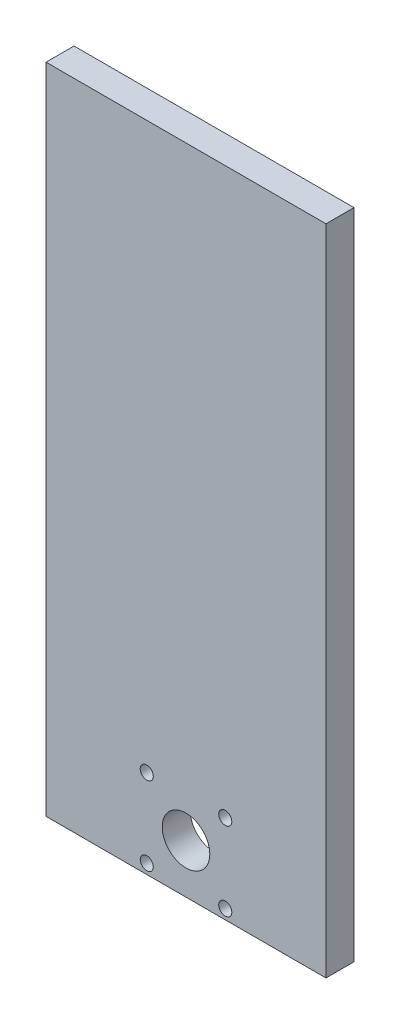
ISO-10303-21;
HEADER;
FILE_DESCRIPTION(('STEP AP214'),'2;1');
FILE_NAME('part.step','',(''),(''),'','','');
FILE_SCHEMA(('AUTOMOTIVE_DESIGN { 1 0 10303 214 1 1 1 1 }'));
ENDSEC;
DATA;
#1=APPLICATION_CONTEXT('core data for automotive mechanical design processes');
#2=APPLICATION_PROTOCOL_DEFINITION('international standard','automotive_design',2000,#1);
#3=PRODUCT_CONTEXT('',#1,'mechanical');
#4=PRODUCT('Part','Part','',(#3));
#5=PRODUCT_RELATED_PRODUCT_CATEGORY('part','',(#4));
#6=PRODUCT_DEFINITION_FORMATION('','',#4);
#7=PRODUCT_DEFINITION_CONTEXT('part definition',#1,'design');
#8=PRODUCT_DEFINITION('design','',#6,#7);
#9=PRODUCT_DEFINITION_SHAPE('','',#8);
#10=(LENGTH_UNIT() NAMED_UNIT(*) SI_UNIT(.MILLI.,.METRE.));
#11=(NAMED_UNIT(*) PLANE_ANGLE_UNIT() SI_UNIT($,.RADIAN.));
#12=(NAMED_UNIT(*) SI_UNIT($,.STERADIAN.) SOLID_ANGLE_UNIT());
#13=UNCERTAINTY_MEASURE_WITH_UNIT(LENGTH_MEASURE(1.E-05),#10,'distance_accuracy_value','');
#14=(GEOMETRIC_REPRESENTATION_CONTEXT(3) GLOBAL_UNCERTAINTY_ASSIGNED_CONTEXT((#13)) GLOBAL_UNIT_ASSIGNED_CONTEXT((#10,
#11,#12)) REPRESENTATION_CONTEXT('',''));
#15=CARTESIAN_POINT('',(0.,0.,0.));
#16=DIRECTION('',(0.,0.,1.));
#17=DIRECTION('',(1.,0.,0.));
#18=AXIS2_PLACEMENT_3D('',#15,#16,#17);
#19=CARTESIAN_POINT('',(-14.9999999999295,-291545.,77.6577310586825));
#20=DIRECTION('',(1.,0.,0.));
#21=DIRECTION('',(0.,1.,0.));
#22=AXIS2_PLACEMENT_3D('',#19,#20,#21);
#23=PLANE('',#22);
#24=DIRECTION('',(0.,-1.,0.));
#25=VECTOR('',#24,1.);
#26=CARTESIAN_POINT('',(-14.9999999999295,-291545.,1.5));
#27=LINE('',#26,#25);
#28=CARTESIAN_POINT('',(-14.9999999999864,35.000000000025,1.5));
#29=VERTEX_POINT('',#28);
#30=CARTESIAN_POINT('',(-14.9999999999864,-35.000000000025,1.5));
#31=VERTEX_POINT('',#30);
#32=EDGE_CURVE('E83',#29,#31,#27,.T.);
#33=ORIENTED_EDGE('',*,*,#32,.F.);
#34=DIRECTION('',(0.,0.,-1.));
#35=VECTOR('',#34,1.);
#36=CARTESIAN_POINT('',(-14.9999999999864,35.000000000025,77.6577310586825));
#37=LINE('',#36,#35);
#38=CARTESIAN_POINT('',(-14.9999999999864,35.000000000025,-1.5));
#39=VERTEX_POINT('',#38);
#40=EDGE_CURVE('E37',#29,#39,#37,.T.);
#41=ORIENTED_EDGE('',*,*,#40,.T.);
#42=DIRECTION('',(0.,-1.,0.));
#43=VECTOR('',#42,1.);
#44=CARTESIAN_POINT('',(-14.9999999999295,-291545.,-1.5));
#45=LINE('',#44,#43);
#46=CARTESIAN_POINT('',(-14.9999999999864,-35.000000000025,-1.5));
#47=VERTEX_POINT('',#46);
#48=EDGE_CURVE('E81',#39,#47,#45,.T.);
#49=ORIENTED_EDGE('',*,*,#48,.T.);
#50=DIRECTION('',(0.,0.,-1.));
#51=VECTOR('',#50,1.);
#52=CARTESIAN_POINT('',(-14.9999999999864,-35.000000000025,77.6577310586825));
#53=LINE('',#52,#51);
#54=EDGE_CURVE('E72',#31,#47,#53,.T.);
#55=ORIENTED_EDGE('',*,*,#54,.F.);
#56=EDGE_LOOP('',(#33,#41,#49,#55));
#57=FACE_BOUND('',#56,.T.);
#58=ADVANCED_FACE('F33',(#57),#23,.F.);
#59=CARTESIAN_POINT('',(-400000.,-35.000000000025,77.6577310586825));
#60=DIRECTION('',(0.,1.,0.));
#61=DIRECTION('',(0.,0.,1.));
#62=AXIS2_PLACEMENT_3D('',#59,#60,#61);
#63=PLANE('',#62);
#64=DIRECTION('',(1.,0.,0.));
#65=VECTOR('',#64,1.);
#66=CARTESIAN_POINT('',(-400000.,-35.000000000025,1.5));
#67=LINE('',#66,#65);
#68=CARTESIAN_POINT('',(15.0000000000071,-35.000000000025,1.5));
#69=VERTEX_POINT('',#68);
#70=EDGE_CURVE('E42',#31,#69,#67,.T.);
#71=ORIENTED_EDGE('',*,*,#70,.F.);
#72=ORIENTED_EDGE('',*,*,#54,.T.);
#73=DIRECTION('',(1.,0.,0.));
#74=VECTOR('',#73,1.);
#75=CARTESIAN_POINT('',(-400000.,-35.000000000025,-1.5));
#76=LINE('',#75,#74);
#77=CARTESIAN_POINT('',(15.0000000000071,-35.000000000025,-1.5));
#78=VERTEX_POINT('',#77);
#79=EDGE_CURVE('E94',#47,#78,#76,.T.);
#80=ORIENTED_EDGE('',*,*,#79,.T.);
#81=DIRECTION('',(0.,0.,-1.));
#82=VECTOR('',#81,1.);
#83=CARTESIAN_POINT('',(15.0000000000071,-35.000000000025,77.6577310586825));
#84=LINE('',#83,#82);
#85=EDGE_CURVE('E103',#69,#78,#84,.T.);
#86=ORIENTED_EDGE('',*,*,#85,.F.);
#87=EDGE_LOOP('',(#71,#72,#80,#86));
#88=FACE_BOUND('',#87,.T.);
#89=ADVANCED_FACE('F148',(#88),#63,.F.);
#90=CARTESIAN_POINT('',(15.0000000000432,-291545.,77.6577310586825));
#91=DIRECTION('',(-1.,0.,0.));
#92=DIRECTION('',(0.,-1.,0.));
#93=AXIS2_PLACEMENT_3D('',#90,#91,#92);
#94=PLANE('',#93);
#95=DIRECTION('',(0.,1.,0.));
#96=VECTOR('',#95,1.);
#97=CARTESIAN_POINT('',(15.0000000000432,-291545.,1.5));
#98=LINE('',#97,#96);
#99=CARTESIAN_POINT('',(14.9999999999864,35.000000000025,1.5));
#100=VERTEX_POINT('',#99);
#101=EDGE_CURVE('E11',#69,#100,#98,.T.);
#102=ORIENTED_EDGE('',*,*,#101,.F.);
#103=ORIENTED_EDGE('',*,*,#85,.T.);
#104=DIRECTION('',(0.,1.,0.));
#105=VECTOR('',#104,1.);
#106=CARTESIAN_POINT('',(15.0000000000432,-291545.,-1.5));
#107=LINE('',#106,#105);
#108=CARTESIAN_POINT('',(14.9999999999864,35.000000000025,-1.5));
#109=VERTEX_POINT('',#108);
#110=EDGE_CURVE('E104',#78,#109,#107,.T.);
#111=ORIENTED_EDGE('',*,*,#110,.T.);
#112=DIRECTION('',(0.,0.,-1.));
#113=VECTOR('',#112,1.);
#114=CARTESIAN_POINT('',(14.9999999999864,35.000000000025,77.6577310586825));
#115=LINE('',#114,#113);
#116=EDGE_CURVE('E55',#100,#109,#115,.T.);
#117=ORIENTED_EDGE('',*,*,#116,.F.);
#118=EDGE_LOOP('',(#102,#103,#111,#117));
#119=FACE_BOUND('',#118,.T.);
#120=ADVANCED_FACE('F147',(#119),#94,.F.);
#121=CARTESIAN_POINT('',(-400000.,35.000000000025,77.6577310586825));
#122=DIRECTION('',(0.,-1.,0.));
#123=DIRECTION('',(0.,0.,-1.));
#124=AXIS2_PLACEMENT_3D('',#121,#122,#123);
#125=PLANE('',#124);
#126=DIRECTION('',(-1.,0.,0.));
#127=VECTOR('',#126,1.);
#128=CARTESIAN_POINT('',(-400000.,35.000000000025,1.5));
#129=LINE('',#128,#127);
#130=EDGE_CURVE('E91',#100,#29,#129,.T.);
#131=ORIENTED_EDGE('',*,*,#130,.F.);
#132=ORIENTED_EDGE('',*,*,#116,.T.);
#133=DIRECTION('',(-1.,0.,0.));
#134=VECTOR('',#133,1.);
#135=CARTESIAN_POINT('',(-400000.,35.000000000025,-1.5));
#136=LINE('',#135,#134);
#137=EDGE_CURVE('E87',#109,#39,#136,.T.);
#138=ORIENTED_EDGE('',*,*,#137,.T.);
#139=ORIENTED_EDGE('',*,*,#40,.F.);
#140=EDGE_LOOP('',(#131,#132,#138,#139));
#141=FACE_BOUND('',#140,.T.);
#142=ADVANCED_FACE('F88',(#141),#125,.F.);
#143=CARTESIAN_POINT('',(0.,0.,-1.5));
#144=DIRECTION('',(0.,0.,1.));
#145=DIRECTION('',(1.,0.,0.));
#146=AXIS2_PLACEMENT_3D('',#143,#144,#145);
#147=PLANE('',#146);
#148=CARTESIAN_POINT('',(4.20728534805995,-33.95,-1.5));
#149=DIRECTION('',(0.,0.,1.));
#150=DIRECTION('',(1.,0.,0.));
#151=AXIS2_PLACEMENT_3D('',#148,#149,#150);
#152=CIRCLE('',#151,0.699999999999998);
#153=CARTESIAN_POINT('',(4.90728534805995,-33.95,-1.5));
#154=VERTEX_POINT('',#153);
#155=EDGE_CURVE('E119',#154,#154,#152,.T.);
#156=ORIENTED_EDGE('',*,*,#155,.T.);
#157=EDGE_LOOP('',(#156));
#158=FACE_BOUND('',#157,.T.);
#159=CARTESIAN_POINT('',(-4.20728534805997,-33.95,-1.5));
#160=DIRECTION('',(0.,0.,1.));
#161=DIRECTION('',(1.,0.,0.));
#162=AXIS2_PLACEMENT_3D('',#159,#160,#161);
#163=CIRCLE('',#162,0.699999999999999);
#164=CARTESIAN_POINT('',(-3.50728534805997,-33.95,-1.5));
#165=VERTEX_POINT('',#164);
#166=EDGE_CURVE('E126',#165,#165,#163,.T.);
#167=ORIENTED_EDGE('',*,*,#166,.T.);
#168=EDGE_LOOP('',(#167));
#169=FACE_BOUND('',#168,.T.);
#170=CARTESIAN_POINT('',(-4.20728534805995,-25.53542930388,-1.5));
#171=DIRECTION('',(0.,0.,1.));
#172=DIRECTION('',(1.,0.,0.));
#173=AXIS2_PLACEMENT_3D('',#170,#171,#172);
#174=CIRCLE('',#173,0.699999999999999);
#175=CARTESIAN_POINT('',(-3.50728534805995,-25.53542930388,-1.5));
#176=VERTEX_POINT('',#175);
#177=EDGE_CURVE('E118',#176,#176,#174,.T.);
#178=ORIENTED_EDGE('',*,*,#177,.T.);
#179=EDGE_LOOP('',(#178));
#180=FACE_BOUND('',#179,.T.);
#181=CARTESIAN_POINT('',(4.20728534805996,-25.5354293038801,-1.5));
#182=DIRECTION('',(0.,0.,1.));
#183=DIRECTION('',(1.,0.,0.));
#184=AXIS2_PLACEMENT_3D('',#181,#182,#183);
#185=CIRCLE('',#184,0.699999999999999);
#186=CARTESIAN_POINT('',(4.90728534805996,-25.5354293038801,-1.5));
#187=VERTEX_POINT('',#186);
#188=EDGE_CURVE('E112',#187,#187,#185,.T.);
#189=ORIENTED_EDGE('',*,*,#188,.T.);
#190=EDGE_LOOP('',(#189));
#191=FACE_BOUND('',#190,.T.);
#192=CARTESIAN_POINT('',(0.,-29.74271465194,-1.5));
#193=DIRECTION('',(0.,0.,1.));
#194=DIRECTION('',(1.,0.,0.));
#195=AXIS2_PLACEMENT_3D('',#192,#193,#194);
#196=CIRCLE('',#195,2.55);
#197=CARTESIAN_POINT('',(2.55,-29.74271465194,-1.5));
#198=VERTEX_POINT('',#197);
#199=EDGE_CURVE('E85',#198,#198,#196,.T.);
#200=ORIENTED_EDGE('',*,*,#199,.T.);
#201=EDGE_LOOP('',(#200));
#202=FACE_BOUND('',#201,.T.);
#203=ORIENTED_EDGE('',*,*,#48,.F.);
#204=ORIENTED_EDGE('',*,*,#137,.F.);
#205=ORIENTED_EDGE('',*,*,#110,.F.);
#206=ORIENTED_EDGE('',*,*,#79,.F.);
#207=EDGE_LOOP('',(#203,#204,#205,#206));
#208=FACE_BOUND('',#207,.T.);
#209=ADVANCED_FACE('F93',(#158,#169,#180,#191,#202,#208),#147,.F.);
#210=CARTESIAN_POINT('',(0.,0.,1.5));
#211=DIRECTION('',(0.,0.,1.));
#212=DIRECTION('',(1.,0.,0.));
#213=AXIS2_PLACEMENT_3D('',#210,#211,#212);
#214=PLANE('',#213);
#215=CARTESIAN_POINT('',(4.20728534805995,-33.95,1.5));
#216=DIRECTION('',(0.,0.,1.));
#217=DIRECTION('',(1.,0.,0.));
#218=AXIS2_PLACEMENT_3D('',#215,#216,#217);
#219=CIRCLE('',#218,0.699999999999998);
#220=CARTESIAN_POINT('',(4.90728534805995,-33.95,1.5));
#221=VERTEX_POINT('',#220);
#222=EDGE_CURVE('E123',#221,#221,#219,.T.);
#223=ORIENTED_EDGE('',*,*,#222,.F.);
#224=EDGE_LOOP('',(#223));
#225=FACE_BOUND('',#224,.T.);
#226=CARTESIAN_POINT('',(-4.20728534805997,-33.95,1.5));
#227=DIRECTION('',(0.,0.,1.));
#228=DIRECTION('',(1.,0.,0.));
#229=AXIS2_PLACEMENT_3D('',#226,#227,#228);
#230=CIRCLE('',#229,0.699999999999999);
#231=CARTESIAN_POINT('',(-3.50728534805997,-33.95,1.5));
#232=VERTEX_POINT('',#231);
#233=EDGE_CURVE('E122',#232,#232,#230,.T.);
#234=ORIENTED_EDGE('',*,*,#233,.F.);
#235=EDGE_LOOP('',(#234));
#236=FACE_BOUND('',#235,.T.);
#237=CARTESIAN_POINT('',(-4.20728534805995,-25.53542930388,1.5));
#238=DIRECTION('',(0.,0.,1.));
#239=DIRECTION('',(1.,0.,0.));
#240=AXIS2_PLACEMENT_3D('',#237,#238,#239);
#241=CIRCLE('',#240,0.699999999999999);
#242=CARTESIAN_POINT('',(-3.50728534805995,-25.53542930388,1.5));
#243=VERTEX_POINT('',#242);
#244=EDGE_CURVE('E129',#243,#243,#241,.T.);
#245=ORIENTED_EDGE('',*,*,#244,.F.);
#246=EDGE_LOOP('',(#245));
#247=FACE_BOUND('',#246,.T.);
#248=CARTESIAN_POINT('',(4.20728534805996,-25.5354293038801,1.5));
#249=DIRECTION('',(0.,0.,1.));
#250=DIRECTION('',(1.,0.,0.));
#251=AXIS2_PLACEMENT_3D('',#248,#249,#250);
#252=CIRCLE('',#251,0.699999999999999);
#253=CARTESIAN_POINT('',(4.90728534805996,-25.5354293038801,1.5));
#254=VERTEX_POINT('',#253);
#255=EDGE_CURVE('E115',#254,#254,#252,.T.);
#256=ORIENTED_EDGE('',*,*,#255,.F.);
#257=EDGE_LOOP('',(#256));
#258=FACE_BOUND('',#257,.T.);
#259=CARTESIAN_POINT('',(0.,-29.74271465194,1.5));
#260=DIRECTION('',(0.,0.,1.));
#261=DIRECTION('',(1.,0.,0.));
#262=AXIS2_PLACEMENT_3D('',#259,#260,#261);
#263=CIRCLE('',#262,2.55);
#264=CARTESIAN_POINT('',(2.55,-29.74271465194,1.5));
#265=VERTEX_POINT('',#264);
#266=EDGE_CURVE('E109',#265,#265,#263,.T.);
#267=ORIENTED_EDGE('',*,*,#266,.F.);
#268=EDGE_LOOP('',(#267));
#269=FACE_BOUND('',#268,.T.);
#270=ORIENTED_EDGE('',*,*,#130,.T.);
#271=ORIENTED_EDGE('',*,*,#32,.T.);
#272=ORIENTED_EDGE('',*,*,#70,.T.);
#273=ORIENTED_EDGE('',*,*,#101,.T.);
#274=EDGE_LOOP('',(#270,#271,#272,#273));
#275=FACE_BOUND('',#274,.T.);
#276=ADVANCED_FACE('F35',(#225,#236,#247,#258,#269,#275),#214,.T.);
#277=CARTESIAN_POINT('',(0.,-29.74271465194,-1.5));
#278=DIRECTION('',(0.,0.,1.));
#279=DIRECTION('',(1.,0.,0.));
#280=AXIS2_PLACEMENT_3D('',#277,#278,#279);
#281=CYLINDRICAL_SURFACE('',#280,2.55);
#282=ORIENTED_EDGE('',*,*,#199,.F.);
#283=EDGE_LOOP('',(#282));
#284=FACE_BOUND('',#283,.T.);
#285=ORIENTED_EDGE('',*,*,#266,.T.);
#286=EDGE_LOOP('',(#285));
#287=FACE_BOUND('',#286,.T.);
#288=ADVANCED_FACE('F141',(#284,#287),#281,.F.);
#289=CARTESIAN_POINT('',(4.20728534805996,-25.5354293038801,-1.5));
#290=DIRECTION('',(0.,0.,1.));
#291=DIRECTION('',(1.,0.,0.));
#292=AXIS2_PLACEMENT_3D('',#289,#290,#291);
#293=CYLINDRICAL_SURFACE('',#292,0.699999999999999);
#294=ORIENTED_EDGE('',*,*,#188,.F.);
#295=EDGE_LOOP('',(#294));
#296=FACE_BOUND('',#295,.T.);
#297=ORIENTED_EDGE('',*,*,#255,.T.);
#298=EDGE_LOOP('',(#297));
#299=FACE_BOUND('',#298,.T.);
#300=ADVANCED_FACE('F164',(#296,#299),#293,.F.);
#301=CARTESIAN_POINT('',(-4.20728534805995,-25.53542930388,-1.5));
#302=DIRECTION('',(0.,0.,1.));
#303=DIRECTION('',(1.,0.,0.));
#304=AXIS2_PLACEMENT_3D('',#301,#302,#303);
#305=CYLINDRICAL_SURFACE('',#304,0.699999999999999);
#306=ORIENTED_EDGE('',*,*,#177,.F.);
#307=EDGE_LOOP('',(#306));
#308=FACE_BOUND('',#307,.T.);
#309=ORIENTED_EDGE('',*,*,#244,.T.);
#310=EDGE_LOOP('',(#309));
#311=FACE_BOUND('',#310,.T.);
#312=ADVANCED_FACE('F137',(#308,#311),#305,.F.);
#313=CARTESIAN_POINT('',(-4.20728534805997,-33.95,-1.5));
#314=DIRECTION('',(0.,0.,1.));
#315=DIRECTION('',(1.,0.,0.));
#316=AXIS2_PLACEMENT_3D('',#313,#314,#315);
#317=CYLINDRICAL_SURFACE('',#316,0.699999999999999);
#318=ORIENTED_EDGE('',*,*,#166,.F.);
#319=EDGE_LOOP('',(#318));
#320=FACE_BOUND('',#319,.T.);
#321=ORIENTED_EDGE('',*,*,#233,.T.);
#322=EDGE_LOOP('',(#321));
#323=FACE_BOUND('',#322,.T.);
#324=ADVANCED_FACE('F172',(#320,#323),#317,.F.);
#325=CARTESIAN_POINT('',(4.20728534805995,-33.95,-1.5));
#326=DIRECTION('',(0.,0.,1.));
#327=DIRECTION('',(1.,0.,0.));
#328=AXIS2_PLACEMENT_3D('',#325,#326,#327);
#329=CYLINDRICAL_SURFACE('',#328,0.699999999999998);
#330=ORIENTED_EDGE('',*,*,#155,.F.);
#331=EDGE_LOOP('',(#330));
#332=FACE_BOUND('',#331,.T.);
#333=ORIENTED_EDGE('',*,*,#222,.T.);
#334=EDGE_LOOP('',(#333));
#335=FACE_BOUND('',#334,.T.);
#336=ADVANCED_FACE('F169',(#332,#335),#329,.F.);
#337=CLOSED_SHELL('',(#58,#89,#120,#142,#209,#276,#288,#300,#312,#324,#336));
#338=MANIFOLD_SOLID_BREP('B2',#337);
#339=ADVANCED_BREP_SHAPE_REPRESENTATION('',(#18,#338),#14);
#340=SHAPE_DEFINITION_REPRESENTATION(#9,#339);
ENDSEC;
END-ISO-10303-21;
